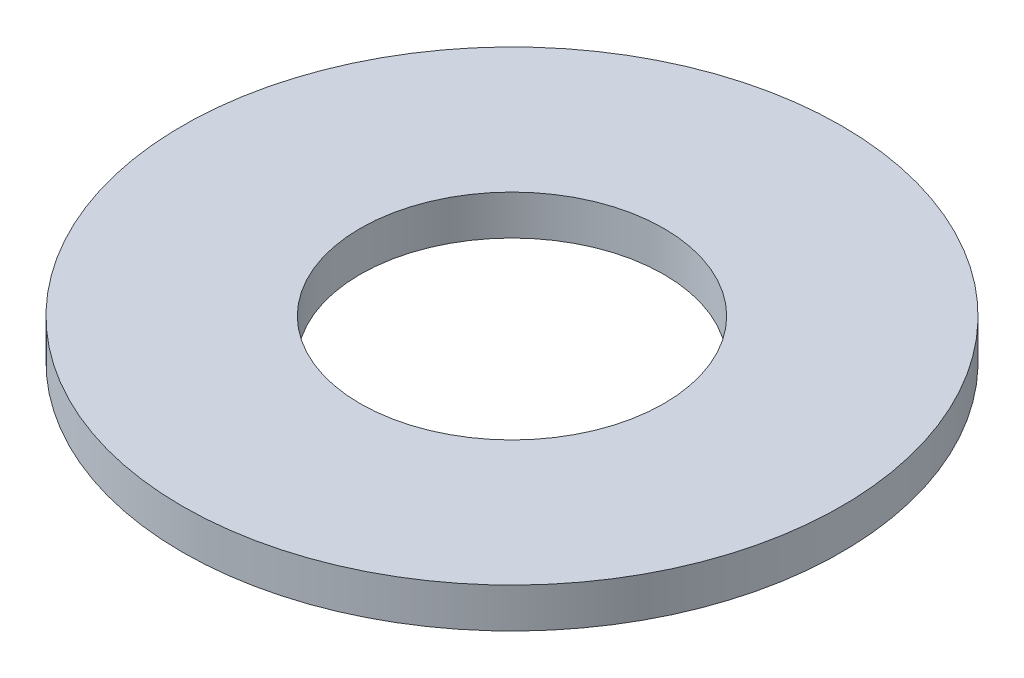
ISO-10303-21;
HEADER;
FILE_DESCRIPTION(('STEP AP214'),'2;1');
FILE_NAME('part.step','',(''),(''),'','','');
FILE_SCHEMA(('AUTOMOTIVE_DESIGN { 1 0 10303 214 1 1 1 1 }'));
ENDSEC;
DATA;
#1=APPLICATION_CONTEXT('core data for automotive mechanical design processes');
#2=APPLICATION_PROTOCOL_DEFINITION('international standard','automotive_design',2000,#1);
#3=PRODUCT_CONTEXT('',#1,'mechanical');
#4=PRODUCT('Part','Part','',(#3));
#5=PRODUCT_RELATED_PRODUCT_CATEGORY('part','',(#4));
#6=PRODUCT_DEFINITION_FORMATION('','',#4);
#7=PRODUCT_DEFINITION_CONTEXT('part definition',#1,'design');
#8=PRODUCT_DEFINITION('design','',#6,#7);
#9=PRODUCT_DEFINITION_SHAPE('','',#8);
#10=(LENGTH_UNIT() NAMED_UNIT(*) SI_UNIT(.MILLI.,.METRE.));
#11=(NAMED_UNIT(*) PLANE_ANGLE_UNIT() SI_UNIT($,.RADIAN.));
#12=(NAMED_UNIT(*) SI_UNIT($,.STERADIAN.) SOLID_ANGLE_UNIT());
#13=UNCERTAINTY_MEASURE_WITH_UNIT(LENGTH_MEASURE(1.E-05),#10,'distance_accuracy_value','');
#14=(GEOMETRIC_REPRESENTATION_CONTEXT(3) GLOBAL_UNCERTAINTY_ASSIGNED_CONTEXT((#13)) GLOBAL_UNIT_ASSIGNED_CONTEXT((#10,
#11,#12)) REPRESENTATION_CONTEXT('',''));
#15=CARTESIAN_POINT('',(0.,0.,0.));
#16=DIRECTION('',(0.,0.,1.));
#17=DIRECTION('',(1.,0.,0.));
#18=AXIS2_PLACEMENT_3D('',#15,#16,#17);
#19=CARTESIAN_POINT('',(0.,-1000.,-3.49148133884313E-12));
#20=DIRECTION('',(0.,-1.,0.));
#21=DIRECTION('',(0.,0.,-1.));
#22=AXIS2_PLACEMENT_3D('',#19,#20,#21);
#23=CYLINDRICAL_SURFACE('',#22,4.1656);
#24=CARTESIAN_POINT('',(0.,0.,0.));
#25=DIRECTION('',(0.,-1.,0.));
#26=DIRECTION('',(0.,0.,-1.));
#27=AXIS2_PLACEMENT_3D('',#24,#25,#26);
#28=CIRCLE('',#27,4.1656);
#29=CARTESIAN_POINT('',(0.,0.,-4.1656));
#30=VERTEX_POINT('',#29);
#31=EDGE_CURVE('E10',#30,#30,#28,.T.);
#32=ORIENTED_EDGE('',*,*,#31,.T.);
#33=EDGE_LOOP('',(#32));
#34=FACE_BOUND('',#33,.T.);
#35=CARTESIAN_POINT('',(0.,1.09219999999999,0.));
#36=DIRECTION('',(0.,-1.,0.));
#37=DIRECTION('',(0.,0.,-1.));
#38=AXIS2_PLACEMENT_3D('',#35,#36,#37);
#39=CIRCLE('',#38,4.1656);
#40=CARTESIAN_POINT('',(0.,1.0922,-4.1656));
#41=VERTEX_POINT('',#40);
#42=EDGE_CURVE('E47',#41,#41,#39,.T.);
#43=ORIENTED_EDGE('',*,*,#42,.F.);
#44=EDGE_LOOP('',(#43));
#45=FACE_BOUND('',#44,.T.);
#46=ADVANCED_FACE('F33',(#34,#45),#23,.F.);
#47=CARTESIAN_POINT('',(0.,0.,-4.1656));
#48=DIRECTION('',(0.,-1.,0.));
#49=DIRECTION('',(0.,0.,-1.));
#50=AXIS2_PLACEMENT_3D('',#47,#48,#49);
#51=PLANE('',#50);
#52=CARTESIAN_POINT('',(0.,0.,0.));
#53=DIRECTION('',(0.,-1.,0.));
#54=DIRECTION('',(0.,0.,-1.));
#55=AXIS2_PLACEMENT_3D('',#52,#53,#54);
#56=CIRCLE('',#55,9.0424);
#57=CARTESIAN_POINT('',(0.,0.,-9.0424));
#58=VERTEX_POINT('',#57);
#59=EDGE_CURVE('E39',#58,#58,#56,.T.);
#60=ORIENTED_EDGE('',*,*,#59,.T.);
#61=EDGE_LOOP('',(#60));
#62=FACE_BOUND('',#61,.T.);
#63=ORIENTED_EDGE('',*,*,#31,.F.);
#64=EDGE_LOOP('',(#63));
#65=FACE_BOUND('',#64,.T.);
#66=ADVANCED_FACE('F57',(#62,#65),#51,.T.);
#67=CARTESIAN_POINT('',(0.,-1000.,-3.49148133884313E-12));
#68=DIRECTION('',(0.,-1.,0.));
#69=DIRECTION('',(0.,0.,-1.));
#70=AXIS2_PLACEMENT_3D('',#67,#68,#69);
#71=CYLINDRICAL_SURFACE('',#70,9.0424);
#72=CARTESIAN_POINT('',(0.,1.09219999999999,0.));
#73=DIRECTION('',(0.,-1.,0.));
#74=DIRECTION('',(0.,0.,-1.));
#75=AXIS2_PLACEMENT_3D('',#72,#73,#74);
#76=CIRCLE('',#75,9.0424);
#77=CARTESIAN_POINT('',(0.,1.09220000000002,-9.0424));
#78=VERTEX_POINT('',#77);
#79=EDGE_CURVE('E43',#78,#78,#76,.T.);
#80=ORIENTED_EDGE('',*,*,#79,.T.);
#81=EDGE_LOOP('',(#80));
#82=FACE_BOUND('',#81,.T.);
#83=ORIENTED_EDGE('',*,*,#59,.F.);
#84=EDGE_LOOP('',(#83));
#85=FACE_BOUND('',#84,.T.);
#86=ADVANCED_FACE('F61',(#82,#85),#71,.T.);
#87=CARTESIAN_POINT('',(0.,1.09220000000001,-9.0424));
#88=DIRECTION('',(0.,1.,0.));
#89=DIRECTION('',(0.,0.,1.));
#90=AXIS2_PLACEMENT_3D('',#87,#88,#89);
#91=PLANE('',#90);
#92=ORIENTED_EDGE('',*,*,#42,.T.);
#93=EDGE_LOOP('',(#92));
#94=FACE_BOUND('',#93,.T.);
#95=ORIENTED_EDGE('',*,*,#79,.F.);
#96=EDGE_LOOP('',(#95));
#97=FACE_BOUND('',#96,.T.);
#98=ADVANCED_FACE('F53',(#94,#97),#91,.T.);
#99=CLOSED_SHELL('',(#46,#66,#86,#98));
#100=MANIFOLD_SOLID_BREP('B2',#99);
#101=ADVANCED_BREP_SHAPE_REPRESENTATION('',(#18,#100),#14);
#102=SHAPE_DEFINITION_REPRESENTATION(#9,#101);
ENDSEC;
END-ISO-10303-21;
